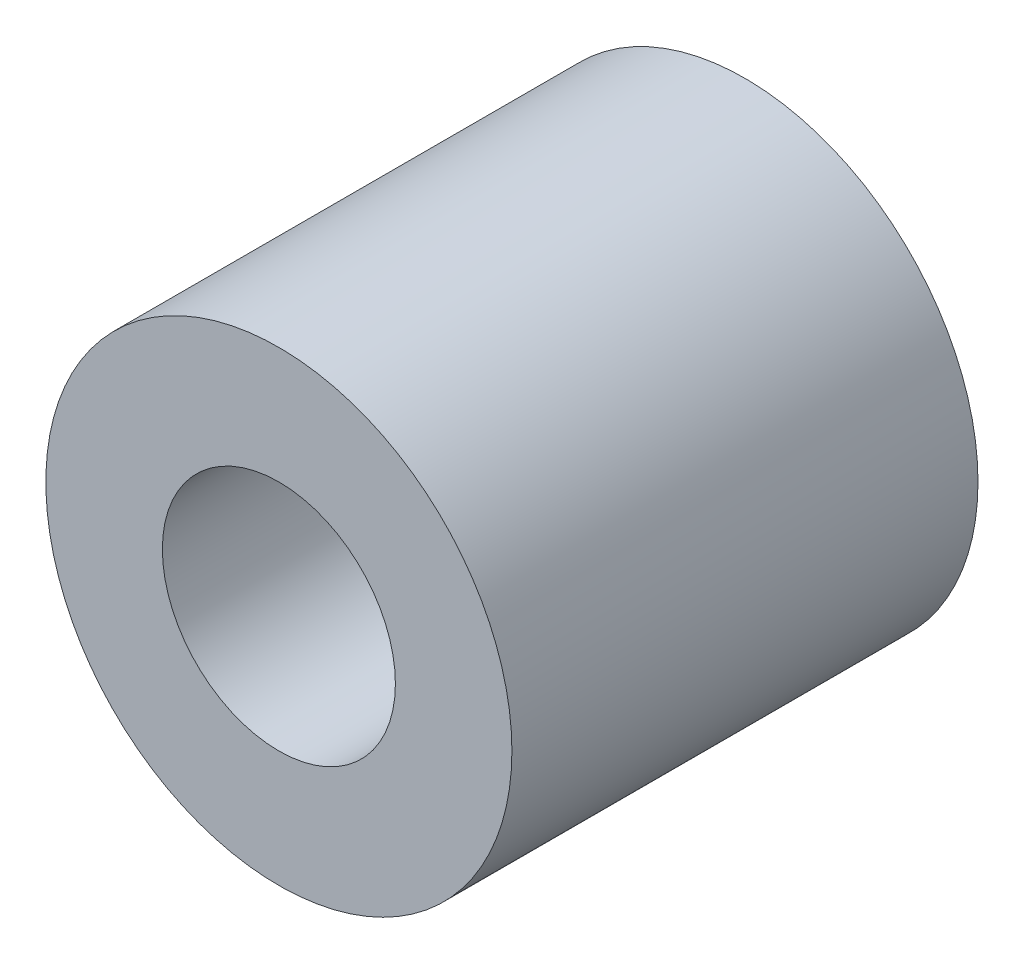
ISO-10303-21;
HEADER;
FILE_DESCRIPTION(('STEP AP214'),'2;1');
FILE_NAME('part.step','',(''),(''),'','','');
FILE_SCHEMA(('AUTOMOTIVE_DESIGN { 1 0 10303 214 1 1 1 1 }'));
ENDSEC;
DATA;
#1=APPLICATION_CONTEXT('core data for automotive mechanical design processes');
#2=APPLICATION_PROTOCOL_DEFINITION('international standard','automotive_design',2000,#1);
#3=PRODUCT_CONTEXT('',#1,'mechanical');
#4=PRODUCT('Part','Part','',(#3));
#5=PRODUCT_RELATED_PRODUCT_CATEGORY('part','',(#4));
#6=PRODUCT_DEFINITION_FORMATION('','',#4);
#7=PRODUCT_DEFINITION_CONTEXT('part definition',#1,'design');
#8=PRODUCT_DEFINITION('design','',#6,#7);
#9=PRODUCT_DEFINITION_SHAPE('','',#8);
#10=(LENGTH_UNIT() NAMED_UNIT(*) SI_UNIT(.MILLI.,.METRE.));
#11=(NAMED_UNIT(*) PLANE_ANGLE_UNIT() SI_UNIT($,.RADIAN.));
#12=(NAMED_UNIT(*) SI_UNIT($,.STERADIAN.) SOLID_ANGLE_UNIT());
#13=UNCERTAINTY_MEASURE_WITH_UNIT(LENGTH_MEASURE(1.E-05),#10,'distance_accuracy_value','');
#14=(GEOMETRIC_REPRESENTATION_CONTEXT(3) GLOBAL_UNCERTAINTY_ASSIGNED_CONTEXT((#13)) GLOBAL_UNIT_ASSIGNED_CONTEXT((#10,
#11,#12)) REPRESENTATION_CONTEXT('',''));
#15=CARTESIAN_POINT('',(0.,0.,0.));
#16=DIRECTION('',(0.,0.,1.));
#17=DIRECTION('',(1.,0.,0.));
#18=AXIS2_PLACEMENT_3D('',#15,#16,#17);
#19=CARTESIAN_POINT('',(0.,0.,10.));
#20=DIRECTION('',(0.,0.,-1.));
#21=DIRECTION('',(-1.,0.,0.));
#22=AXIS2_PLACEMENT_3D('',#19,#20,#21);
#23=CYLINDRICAL_SURFACE('',#22,5.);
#24=CARTESIAN_POINT('',(0.,0.,10.));
#25=DIRECTION('',(0.,0.,1.));
#26=DIRECTION('',(1.,0.,0.));
#27=AXIS2_PLACEMENT_3D('',#24,#25,#26);
#28=CIRCLE('',#27,5.);
#29=CARTESIAN_POINT('',(5.,0.,10.));
#30=VERTEX_POINT('',#29);
#31=EDGE_CURVE('E10',#30,#30,#28,.T.);
#32=ORIENTED_EDGE('',*,*,#31,.F.);
#33=EDGE_LOOP('',(#32));
#34=FACE_BOUND('',#33,.T.);
#35=CARTESIAN_POINT('',(0.,0.,0.));
#36=DIRECTION('',(0.,0.,1.));
#37=DIRECTION('',(1.,0.,0.));
#38=AXIS2_PLACEMENT_3D('',#35,#36,#37);
#39=CIRCLE('',#38,5.);
#40=CARTESIAN_POINT('',(5.,0.,0.));
#41=VERTEX_POINT('',#40);
#42=EDGE_CURVE('E40',#41,#41,#39,.T.);
#43=ORIENTED_EDGE('',*,*,#42,.T.);
#44=EDGE_LOOP('',(#43));
#45=FACE_BOUND('',#44,.T.);
#46=ADVANCED_FACE('F37',(#34,#45),#23,.T.);
#47=CARTESIAN_POINT('',(0.,0.,10.));
#48=DIRECTION('',(0.,0.,1.));
#49=DIRECTION('',(1.,0.,0.));
#50=AXIS2_PLACEMENT_3D('',#47,#48,#49);
#51=PLANE('',#50);
#52=CARTESIAN_POINT('',(0.,0.,10.));
#53=DIRECTION('',(0.,0.,1.));
#54=DIRECTION('',(1.,0.,0.));
#55=AXIS2_PLACEMENT_3D('',#52,#53,#54);
#56=CIRCLE('',#55,2.5);
#57=CARTESIAN_POINT('',(2.5,0.,10.));
#58=VERTEX_POINT('',#57);
#59=EDGE_CURVE('E54',#58,#58,#56,.T.);
#60=ORIENTED_EDGE('',*,*,#59,.F.);
#61=EDGE_LOOP('',(#60));
#62=FACE_BOUND('',#61,.T.);
#63=ORIENTED_EDGE('',*,*,#31,.T.);
#64=EDGE_LOOP('',(#63));
#65=FACE_BOUND('',#64,.T.);
#66=ADVANCED_FACE('F62',(#62,#65),#51,.T.);
#67=CARTESIAN_POINT('',(0.,0.,0.));
#68=DIRECTION('',(0.,0.,1.));
#69=DIRECTION('',(1.,0.,0.));
#70=AXIS2_PLACEMENT_3D('',#67,#68,#69);
#71=PLANE('',#70);
#72=CARTESIAN_POINT('',(0.,0.,0.));
#73=DIRECTION('',(0.,0.,1.));
#74=DIRECTION('',(1.,0.,0.));
#75=AXIS2_PLACEMENT_3D('',#72,#73,#74);
#76=CIRCLE('',#75,2.5);
#77=CARTESIAN_POINT('',(2.5,0.,0.));
#78=VERTEX_POINT('',#77);
#79=EDGE_CURVE('E49',#78,#78,#76,.F.);
#80=ORIENTED_EDGE('',*,*,#79,.F.);
#81=EDGE_LOOP('',(#80));
#82=FACE_BOUND('',#81,.T.);
#83=ORIENTED_EDGE('',*,*,#42,.F.);
#84=EDGE_LOOP('',(#83));
#85=FACE_BOUND('',#84,.T.);
#86=ADVANCED_FACE('F64',(#82,#85),#71,.F.);
#87=CARTESIAN_POINT('',(0.,0.,-0.000999999999999265));
#88=DIRECTION('',(0.,0.,1.));
#89=DIRECTION('',(1.,0.,0.));
#90=AXIS2_PLACEMENT_3D('',#87,#88,#89);
#91=CYLINDRICAL_SURFACE('',#90,2.5);
#92=ORIENTED_EDGE('',*,*,#59,.T.);
#93=EDGE_LOOP('',(#92));
#94=FACE_BOUND('',#93,.T.);
#95=ORIENTED_EDGE('',*,*,#79,.T.);
#96=EDGE_LOOP('',(#95));
#97=FACE_BOUND('',#96,.T.);
#98=ADVANCED_FACE('F59',(#94,#97),#91,.F.);
#99=CLOSED_SHELL('',(#46,#66,#86,#98));
#100=MANIFOLD_SOLID_BREP('B2',#99);
#101=ADVANCED_BREP_SHAPE_REPRESENTATION('',(#18,#100),#14);
#102=SHAPE_DEFINITION_REPRESENTATION(#9,#101);
ENDSEC;
END-ISO-10303-21;
